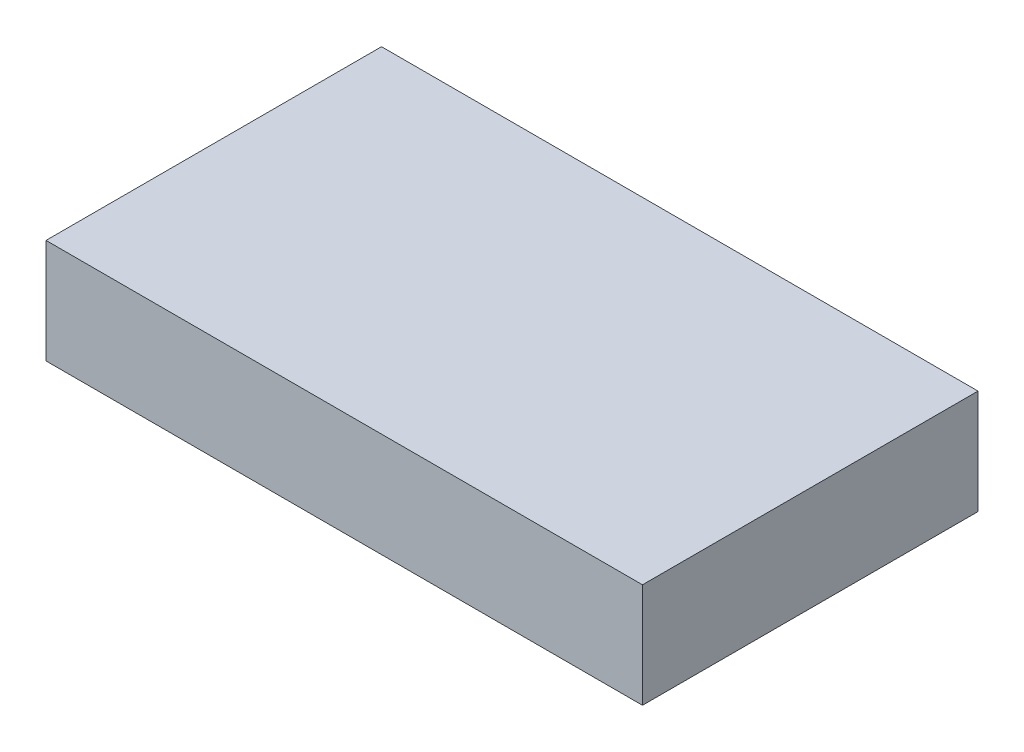
ISO-10303-21;
HEADER;
FILE_DESCRIPTION(('STEP AP214'),'2;1');
FILE_NAME('part.step','',(''),(''),'','','');
FILE_SCHEMA(('AUTOMOTIVE_DESIGN { 1 0 10303 214 1 1 1 1 }'));
ENDSEC;
DATA;
#1=APPLICATION_CONTEXT('core data for automotive mechanical design processes');
#2=APPLICATION_PROTOCOL_DEFINITION('international standard','automotive_design',2000,#1);
#3=PRODUCT_CONTEXT('',#1,'mechanical');
#4=PRODUCT('Part','Part','',(#3));
#5=PRODUCT_RELATED_PRODUCT_CATEGORY('part','',(#4));
#6=PRODUCT_DEFINITION_FORMATION('','',#4);
#7=PRODUCT_DEFINITION_CONTEXT('part definition',#1,'design');
#8=PRODUCT_DEFINITION('design','',#6,#7);
#9=PRODUCT_DEFINITION_SHAPE('','',#8);
#10=(LENGTH_UNIT() NAMED_UNIT(*) SI_UNIT(.MILLI.,.METRE.));
#11=(NAMED_UNIT(*) PLANE_ANGLE_UNIT() SI_UNIT($,.RADIAN.));
#12=(NAMED_UNIT(*) SI_UNIT($,.STERADIAN.) SOLID_ANGLE_UNIT());
#13=UNCERTAINTY_MEASURE_WITH_UNIT(LENGTH_MEASURE(1.E-05),#10,'distance_accuracy_value','');
#14=(GEOMETRIC_REPRESENTATION_CONTEXT(3) GLOBAL_UNCERTAINTY_ASSIGNED_CONTEXT((#13)) GLOBAL_UNIT_ASSIGNED_CONTEXT((#10,
#11,#12)) REPRESENTATION_CONTEXT('',''));
#15=CARTESIAN_POINT('',(0.,0.,0.));
#16=DIRECTION('',(0.,0.,1.));
#17=DIRECTION('',(1.,0.,0.));
#18=AXIS2_PLACEMENT_3D('',#15,#16,#17);
#19=CARTESIAN_POINT('',(0.,0.,4.5));
#20=DIRECTION('',(1.,0.,0.));
#21=DIRECTION('',(0.,0.,-1.));
#22=AXIS2_PLACEMENT_3D('',#19,#20,#21);
#23=PLANE('',#22);
#24=DIRECTION('',(0.,-1.,0.));
#25=VECTOR('',#24,1.);
#26=CARTESIAN_POINT('',(0.,0.,0.));
#27=LINE('',#26,#25);
#28=CARTESIAN_POINT('',(0.,1.4,0.));
#29=VERTEX_POINT('',#28);
#30=CARTESIAN_POINT('',(0.,0.,0.));
#31=VERTEX_POINT('',#30);
#32=EDGE_CURVE('E100',#29,#31,#27,.T.);
#33=ORIENTED_EDGE('',*,*,#32,.T.);
#34=DIRECTION('',(0.,0.,-1.));
#35=VECTOR('',#34,1.);
#36=CARTESIAN_POINT('',(0.,0.,4.5));
#37=LINE('',#36,#35);
#38=CARTESIAN_POINT('',(0.,0.,4.5));
#39=VERTEX_POINT('',#38);
#40=EDGE_CURVE('E11',#39,#31,#37,.T.);
#41=ORIENTED_EDGE('',*,*,#40,.F.);
#42=DIRECTION('',(0.,-1.,0.));
#43=VECTOR('',#42,1.);
#44=CARTESIAN_POINT('',(0.,0.,4.5));
#45=LINE('',#44,#43);
#46=CARTESIAN_POINT('',(0.,1.4,4.5));
#47=VERTEX_POINT('',#46);
#48=EDGE_CURVE('E88',#47,#39,#45,.T.);
#49=ORIENTED_EDGE('',*,*,#48,.F.);
#50=DIRECTION('',(0.,0.,-1.));
#51=VECTOR('',#50,1.);
#52=CARTESIAN_POINT('',(0.,1.4,4.5));
#53=LINE('',#52,#51);
#54=EDGE_CURVE('E96',#47,#29,#53,.T.);
#55=ORIENTED_EDGE('',*,*,#54,.T.);
#56=EDGE_LOOP('',(#33,#41,#49,#55));
#57=FACE_BOUND('',#56,.T.);
#58=ADVANCED_FACE('F37',(#57),#23,.F.);
#59=CARTESIAN_POINT('',(0.,0.,4.5));
#60=DIRECTION('',(0.,1.,0.));
#61=DIRECTION('',(0.,0.,1.));
#62=AXIS2_PLACEMENT_3D('',#59,#60,#61);
#63=PLANE('',#62);
#64=DIRECTION('',(1.,0.,0.));
#65=VECTOR('',#64,1.);
#66=CARTESIAN_POINT('',(0.,0.,0.));
#67=LINE('',#66,#65);
#68=CARTESIAN_POINT('',(8.,0.,0.));
#69=VERTEX_POINT('',#68);
#70=EDGE_CURVE('E92',#31,#69,#67,.T.);
#71=ORIENTED_EDGE('',*,*,#70,.T.);
#72=DIRECTION('',(0.,0.,-1.));
#73=VECTOR('',#72,1.);
#74=CARTESIAN_POINT('',(8.,0.,4.5));
#75=LINE('',#74,#73);
#76=CARTESIAN_POINT('',(8.,0.,4.5));
#77=VERTEX_POINT('',#76);
#78=EDGE_CURVE('E45',#77,#69,#75,.T.);
#79=ORIENTED_EDGE('',*,*,#78,.F.);
#80=DIRECTION('',(1.,0.,0.));
#81=VECTOR('',#80,1.);
#82=CARTESIAN_POINT('',(0.,0.,4.5));
#83=LINE('',#82,#81);
#84=EDGE_CURVE('E83',#39,#77,#83,.T.);
#85=ORIENTED_EDGE('',*,*,#84,.F.);
#86=ORIENTED_EDGE('',*,*,#40,.T.);
#87=EDGE_LOOP('',(#71,#79,#85,#86));
#88=FACE_BOUND('',#87,.T.);
#89=ADVANCED_FACE('F91',(#88),#63,.F.);
#90=CARTESIAN_POINT('',(8.,0.,4.5));
#91=DIRECTION('',(-1.,0.,0.));
#92=DIRECTION('',(0.,0.,1.));
#93=AXIS2_PLACEMENT_3D('',#90,#91,#92);
#94=PLANE('',#93);
#95=DIRECTION('',(0.,1.,0.));
#96=VECTOR('',#95,1.);
#97=CARTESIAN_POINT('',(8.,0.,0.));
#98=LINE('',#97,#96);
#99=CARTESIAN_POINT('',(8.,1.4,0.));
#100=VERTEX_POINT('',#99);
#101=EDGE_CURVE('E70',#69,#100,#98,.T.);
#102=ORIENTED_EDGE('',*,*,#101,.T.);
#103=DIRECTION('',(0.,0.,-1.));
#104=VECTOR('',#103,1.);
#105=CARTESIAN_POINT('',(8.,1.4,4.5));
#106=LINE('',#105,#104);
#107=CARTESIAN_POINT('',(8.,1.4,4.5));
#108=VERTEX_POINT('',#107);
#109=EDGE_CURVE('E93',#108,#100,#106,.T.);
#110=ORIENTED_EDGE('',*,*,#109,.F.);
#111=DIRECTION('',(0.,1.,0.));
#112=VECTOR('',#111,1.);
#113=CARTESIAN_POINT('',(8.,0.,4.5));
#114=LINE('',#113,#112);
#115=EDGE_CURVE('E86',#77,#108,#114,.T.);
#116=ORIENTED_EDGE('',*,*,#115,.F.);
#117=ORIENTED_EDGE('',*,*,#78,.T.);
#118=EDGE_LOOP('',(#102,#110,#116,#117));
#119=FACE_BOUND('',#118,.T.);
#120=ADVANCED_FACE('F94',(#119),#94,.F.);
#121=CARTESIAN_POINT('',(0.,1.4,4.5));
#122=DIRECTION('',(0.,-1.,0.));
#123=DIRECTION('',(0.,0.,-1.));
#124=AXIS2_PLACEMENT_3D('',#121,#122,#123);
#125=PLANE('',#124);
#126=DIRECTION('',(-1.,0.,0.));
#127=VECTOR('',#126,1.);
#128=CARTESIAN_POINT('',(0.,1.4,0.));
#129=LINE('',#128,#127);
#130=EDGE_CURVE('E76',#100,#29,#129,.T.);
#131=ORIENTED_EDGE('',*,*,#130,.T.);
#132=ORIENTED_EDGE('',*,*,#54,.F.);
#133=DIRECTION('',(-1.,0.,0.));
#134=VECTOR('',#133,1.);
#135=CARTESIAN_POINT('',(0.,1.4,4.5));
#136=LINE('',#135,#134);
#137=EDGE_CURVE('E53',#108,#47,#136,.T.);
#138=ORIENTED_EDGE('',*,*,#137,.F.);
#139=ORIENTED_EDGE('',*,*,#109,.T.);
#140=EDGE_LOOP('',(#131,#132,#138,#139));
#141=FACE_BOUND('',#140,.T.);
#142=ADVANCED_FACE('F107',(#141),#125,.F.);
#143=CARTESIAN_POINT('',(0.,0.,4.5));
#144=DIRECTION('',(0.,0.,-1.));
#145=DIRECTION('',(-1.,0.,0.));
#146=AXIS2_PLACEMENT_3D('',#143,#144,#145);
#147=PLANE('',#146);
#148=ORIENTED_EDGE('',*,*,#48,.T.);
#149=ORIENTED_EDGE('',*,*,#84,.T.);
#150=ORIENTED_EDGE('',*,*,#115,.T.);
#151=ORIENTED_EDGE('',*,*,#137,.T.);
#152=EDGE_LOOP('',(#148,#149,#150,#151));
#153=FACE_BOUND('',#152,.T.);
#154=ADVANCED_FACE('F84',(#153),#147,.F.);
#155=CARTESIAN_POINT('',(0.,0.,0.));
#156=DIRECTION('',(0.,0.,-1.));
#157=DIRECTION('',(-1.,0.,0.));
#158=AXIS2_PLACEMENT_3D('',#155,#156,#157);
#159=PLANE('',#158);
#160=ORIENTED_EDGE('',*,*,#32,.F.);
#161=ORIENTED_EDGE('',*,*,#130,.F.);
#162=ORIENTED_EDGE('',*,*,#101,.F.);
#163=ORIENTED_EDGE('',*,*,#70,.F.);
#164=EDGE_LOOP('',(#160,#161,#162,#163));
#165=FACE_BOUND('',#164,.T.);
#166=ADVANCED_FACE('F110',(#165),#159,.T.);
#167=CLOSED_SHELL('',(#58,#89,#120,#142,#154,#166));
#168=MANIFOLD_SOLID_BREP('B2',#167);
#169=ADVANCED_BREP_SHAPE_REPRESENTATION('',(#18,#168),#14);
#170=SHAPE_DEFINITION_REPRESENTATION(#9,#169);
ENDSEC;
END-ISO-10303-21;
